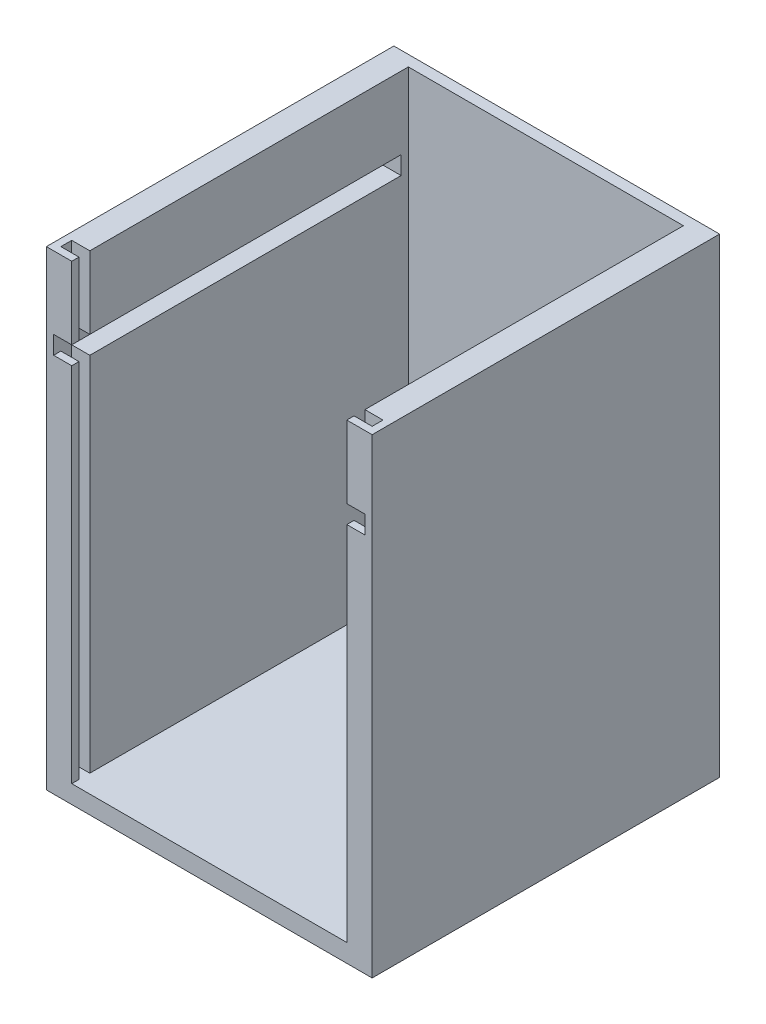
ISO-10303-21;
HEADER;
FILE_DESCRIPTION(('STEP AP214'),'2;1');
FILE_NAME('part.step','',(''),(''),'','','');
FILE_SCHEMA(('AUTOMOTIVE_DESIGN { 1 0 10303 214 1 1 1 1 }'));
ENDSEC;
DATA;
#1=APPLICATION_CONTEXT('core data for automotive mechanical design processes');
#2=APPLICATION_PROTOCOL_DEFINITION('international standard','automotive_design',2000,#1);
#3=PRODUCT_CONTEXT('',#1,'mechanical');
#4=PRODUCT('Part','Part','',(#3));
#5=PRODUCT_RELATED_PRODUCT_CATEGORY('part','',(#4));
#6=PRODUCT_DEFINITION_FORMATION('','',#4);
#7=PRODUCT_DEFINITION_CONTEXT('part definition',#1,'design');
#8=PRODUCT_DEFINITION('design','',#6,#7);
#9=PRODUCT_DEFINITION_SHAPE('','',#8);
#10=(LENGTH_UNIT() NAMED_UNIT(*) SI_UNIT(.MILLI.,.METRE.));
#11=(NAMED_UNIT(*) PLANE_ANGLE_UNIT() SI_UNIT($,.RADIAN.));
#12=(NAMED_UNIT(*) SI_UNIT($,.STERADIAN.) SOLID_ANGLE_UNIT());
#13=UNCERTAINTY_MEASURE_WITH_UNIT(LENGTH_MEASURE(1.E-05),#10,'distance_accuracy_value','');
#14=(GEOMETRIC_REPRESENTATION_CONTEXT(3) GLOBAL_UNCERTAINTY_ASSIGNED_CONTEXT((#13)) GLOBAL_UNIT_ASSIGNED_CONTEXT((#10,
#11,#12)) REPRESENTATION_CONTEXT('',''));
#15=CARTESIAN_POINT('',(0.,0.,0.));
#16=DIRECTION('',(0.,0.,1.));
#17=DIRECTION('',(1.,0.,0.));
#18=AXIS2_PLACEMENT_3D('',#15,#16,#17);
#19=CARTESIAN_POINT('',(86.,5.,3.));
#20=DIRECTION('',(1.,0.,0.));
#21=DIRECTION('',(0.,0.,-1.));
#22=AXIS2_PLACEMENT_3D('',#19,#20,#21);
#23=PLANE('',#22);
#24=DIRECTION('',(0.,1.,0.));
#25=VECTOR('',#24,1.);
#26=CARTESIAN_POINT('',(86.,0.,96.));
#27=LINE('',#26,#25);
#28=CARTESIAN_POINT('',(86.,-125.,96.));
#29=VERTEX_POINT('',#28);
#30=CARTESIAN_POINT('',(86.,-25.,96.));
#31=VERTEX_POINT('',#30);
#32=EDGE_CURVE('E291',#29,#31,#27,.T.);
#33=ORIENTED_EDGE('',*,*,#32,.T.);
#34=DIRECTION('',(0.,0.,-1.));
#35=VECTOR('',#34,1.);
#36=CARTESIAN_POINT('',(86.,-25.,3.));
#37=LINE('',#36,#35);
#38=CARTESIAN_POINT('',(86.,-25.,94.));
#39=VERTEX_POINT('',#38);
#40=EDGE_CURVE('E446',#31,#39,#37,.T.);
#41=ORIENTED_EDGE('',*,*,#40,.T.);
#42=DIRECTION('',(0.,-1.,0.));
#43=VECTOR('',#42,1.);
#44=CARTESIAN_POINT('',(86.,5.,94.));
#45=LINE('',#44,#43);
#46=CARTESIAN_POINT('',(86.,-125.,94.));
#47=VERTEX_POINT('',#46);
#48=EDGE_CURVE('E535',#39,#47,#45,.T.);
#49=ORIENTED_EDGE('',*,*,#48,.T.);
#50=DIRECTION('',(0.,0.,1.));
#51=VECTOR('',#50,1.);
#52=CARTESIAN_POINT('',(86.,-125.,3.));
#53=LINE('',#52,#51);
#54=EDGE_CURVE('E550',#47,#29,#53,.T.);
#55=ORIENTED_EDGE('',*,*,#54,.T.);
#56=EDGE_LOOP('',(#33,#41,#49,#55));
#57=FACE_BOUND('',#56,.T.);
#58=ADVANCED_FACE('F44',(#57),#23,.F.);
#59=CARTESIAN_POINT('',(10.,5.,3.));
#60=DIRECTION('',(-1.,0.,0.));
#61=DIRECTION('',(0.,0.,1.));
#62=AXIS2_PLACEMENT_3D('',#59,#60,#61);
#63=PLANE('',#62);
#64=DIRECTION('',(0.,1.,0.));
#65=VECTOR('',#64,1.);
#66=CARTESIAN_POINT('',(10.,5.,94.));
#67=LINE('',#66,#65);
#68=CARTESIAN_POINT('',(10.,-125.,94.));
#69=VERTEX_POINT('',#68);
#70=CARTESIAN_POINT('',(10.,-25.,94.));
#71=VERTEX_POINT('',#70);
#72=EDGE_CURVE('E531',#69,#71,#67,.T.);
#73=ORIENTED_EDGE('',*,*,#72,.T.);
#74=DIRECTION('',(0.,0.,1.));
#75=VECTOR('',#74,1.);
#76=CARTESIAN_POINT('',(10.,-25.,3.));
#77=LINE('',#76,#75);
#78=CARTESIAN_POINT('',(10.,-25.,96.));
#79=VERTEX_POINT('',#78);
#80=EDGE_CURVE('E469',#71,#79,#77,.T.);
#81=ORIENTED_EDGE('',*,*,#80,.T.);
#82=DIRECTION('',(0.,-1.,0.));
#83=VECTOR('',#82,1.);
#84=CARTESIAN_POINT('',(10.,0.,96.));
#85=LINE('',#84,#83);
#86=CARTESIAN_POINT('',(10.,-125.,96.));
#87=VERTEX_POINT('',#86);
#88=EDGE_CURVE('E290',#79,#87,#85,.T.);
#89=ORIENTED_EDGE('',*,*,#88,.T.);
#90=DIRECTION('',(0.,0.,-1.));
#91=VECTOR('',#90,1.);
#92=CARTESIAN_POINT('',(10.,-125.,3.));
#93=LINE('',#92,#91);
#94=EDGE_CURVE('E323',#87,#69,#93,.T.);
#95=ORIENTED_EDGE('',*,*,#94,.T.);
#96=EDGE_LOOP('',(#73,#81,#89,#95));
#97=FACE_BOUND('',#96,.T.);
#98=ADVANCED_FACE('F615',(#97),#63,.F.);
#99=CARTESIAN_POINT('',(0.,0.,94.));
#100=DIRECTION('',(0.,0.,1.));
#101=DIRECTION('',(1.,0.,0.));
#102=AXIS2_PLACEMENT_3D('',#99,#100,#101);
#103=PLANE('',#102);
#104=DIRECTION('',(0.,-1.,0.));
#105=VECTOR('',#104,1.);
#106=CARTESIAN_POINT('',(5.,0.,94.));
#107=LINE('',#106,#105);
#108=CARTESIAN_POINT('',(5.00000000000001,-25.,94.));
#109=VERTEX_POINT('',#108);
#110=CARTESIAN_POINT('',(5.00000000000002,-125.,94.));
#111=VERTEX_POINT('',#110);
#112=EDGE_CURVE('E477',#109,#111,#107,.T.);
#113=ORIENTED_EDGE('',*,*,#112,.F.);
#114=DIRECTION('',(1.,0.,0.));
#115=VECTOR('',#114,1.);
#116=CARTESIAN_POINT('',(0.,-25.,94.));
#117=LINE('',#116,#115);
#118=EDGE_CURVE('E465',#109,#71,#117,.T.);
#119=ORIENTED_EDGE('',*,*,#118,.T.);
#120=ORIENTED_EDGE('',*,*,#72,.F.);
#121=DIRECTION('',(1.,0.,0.));
#122=VECTOR('',#121,1.);
#123=CARTESIAN_POINT('',(5.00000000000002,-125.,94.));
#124=LINE('',#123,#122);
#125=EDGE_CURVE('E502',#111,#69,#124,.T.);
#126=ORIENTED_EDGE('',*,*,#125,.F.);
#127=EDGE_LOOP('',(#113,#119,#120,#126));
#128=FACE_BOUND('',#127,.T.);
#129=ADVANCED_FACE('F619',(#128),#103,.F.);
#130=CARTESIAN_POINT('',(0.,0.,91.));
#131=DIRECTION('',(0.,0.,1.));
#132=DIRECTION('',(1.,0.,0.));
#133=AXIS2_PLACEMENT_3D('',#130,#131,#132);
#134=PLANE('',#133);
#135=DIRECTION('',(1.,0.,0.));
#136=VECTOR('',#135,1.);
#137=CARTESIAN_POINT('',(0.,-25.,91.));
#138=LINE('',#137,#136);
#139=CARTESIAN_POINT('',(5.,-25.,91.));
#140=VERTEX_POINT('',#139);
#141=CARTESIAN_POINT('',(10.,-25.,91.));
#142=VERTEX_POINT('',#141);
#143=EDGE_CURVE('E458',#140,#142,#138,.T.);
#144=ORIENTED_EDGE('',*,*,#143,.F.);
#145=DIRECTION('',(0.,-1.,0.));
#146=VECTOR('',#145,1.);
#147=CARTESIAN_POINT('',(5.,0.,91.));
#148=LINE('',#147,#146);
#149=CARTESIAN_POINT('',(5.00000000000002,-125.,91.));
#150=VERTEX_POINT('',#149);
#151=EDGE_CURVE('E483',#140,#150,#148,.T.);
#152=ORIENTED_EDGE('',*,*,#151,.T.);
#153=DIRECTION('',(1.,0.,0.));
#154=VECTOR('',#153,1.);
#155=CARTESIAN_POINT('',(5.00000000000002,-125.,91.));
#156=LINE('',#155,#154);
#157=CARTESIAN_POINT('',(10.,-125.,91.));
#158=VERTEX_POINT('',#157);
#159=EDGE_CURVE('E484',#150,#158,#156,.T.);
#160=ORIENTED_EDGE('',*,*,#159,.T.);
#161=DIRECTION('',(0.,1.,0.));
#162=VECTOR('',#161,1.);
#163=CARTESIAN_POINT('',(10.,5.,91.));
#164=LINE('',#163,#162);
#165=EDGE_CURVE('E541',#158,#142,#164,.T.);
#166=ORIENTED_EDGE('',*,*,#165,.T.);
#167=EDGE_LOOP('',(#144,#152,#160,#166));
#168=FACE_BOUND('',#167,.T.);
#169=ADVANCED_FACE('F628',(#168),#134,.T.);
#170=DIRECTION('',(1.,0.,0.));
#171=VECTOR('',#170,1.);
#172=CARTESIAN_POINT('',(0.,-25.,91.));
#173=LINE('',#172,#171);
#174=CARTESIAN_POINT('',(86.,-25.,91.));
#175=VERTEX_POINT('',#174);
#176=CARTESIAN_POINT('',(91.,-25.,91.));
#177=VERTEX_POINT('',#176);
#178=EDGE_CURVE('E450',#175,#177,#173,.T.);
#179=ORIENTED_EDGE('',*,*,#178,.F.);
#180=DIRECTION('',(0.,-1.,0.));
#181=VECTOR('',#180,1.);
#182=CARTESIAN_POINT('',(86.,5.,91.));
#183=LINE('',#182,#181);
#184=CARTESIAN_POINT('',(86.,-125.,91.));
#185=VERTEX_POINT('',#184);
#186=EDGE_CURVE('E545',#175,#185,#183,.T.);
#187=ORIENTED_EDGE('',*,*,#186,.T.);
#188=CARTESIAN_POINT('',(91.,-125.,91.));
#189=VERTEX_POINT('',#188);
#190=EDGE_CURVE('E482',#185,#189,#156,.T.);
#191=ORIENTED_EDGE('',*,*,#190,.T.);
#192=DIRECTION('',(0.,1.,0.));
#193=VECTOR('',#192,1.);
#194=CARTESIAN_POINT('',(91.,0.,91.));
#195=LINE('',#194,#193);
#196=EDGE_CURVE('E488',#189,#177,#195,.T.);
#197=ORIENTED_EDGE('',*,*,#196,.T.);
#198=EDGE_LOOP('',(#179,#187,#191,#197));
#199=FACE_BOUND('',#198,.T.);
#200=ADVANCED_FACE('F743',(#199),#134,.T.);
#201=ORIENTED_EDGE('',*,*,#48,.F.);
#202=DIRECTION('',(1.,0.,0.));
#203=VECTOR('',#202,1.);
#204=CARTESIAN_POINT('',(0.,-25.,94.));
#205=LINE('',#204,#203);
#206=CARTESIAN_POINT('',(91.,-25.,94.));
#207=VERTEX_POINT('',#206);
#208=EDGE_CURVE('E442',#39,#207,#205,.T.);
#209=ORIENTED_EDGE('',*,*,#208,.T.);
#210=DIRECTION('',(0.,1.,0.));
#211=VECTOR('',#210,1.);
#212=CARTESIAN_POINT('',(91.,0.,94.));
#213=LINE('',#212,#211);
#214=CARTESIAN_POINT('',(91.,-125.,94.));
#215=VERTEX_POINT('',#214);
#216=EDGE_CURVE('E507',#215,#207,#213,.T.);
#217=ORIENTED_EDGE('',*,*,#216,.F.);
#218=EDGE_CURVE('E501',#47,#215,#124,.T.);
#219=ORIENTED_EDGE('',*,*,#218,.F.);
#220=EDGE_LOOP('',(#201,#209,#217,#219));
#221=FACE_BOUND('',#220,.T.);
#222=ADVANCED_FACE('F696',(#221),#103,.F.);
#223=CARTESIAN_POINT('',(0.,0.,96.));
#224=DIRECTION('',(0.,-1.,0.));
#225=DIRECTION('',(0.,0.,-1.));
#226=AXIS2_PLACEMENT_3D('',#223,#224,#225);
#227=PLANE('',#226);
#228=DIRECTION('',(-1.,0.,0.));
#229=VECTOR('',#228,1.);
#230=CARTESIAN_POINT('',(0.,0.,96.));
#231=LINE('',#230,#229);
#232=CARTESIAN_POINT('',(93.,0.,96.));
#233=VERTEX_POINT('',#232);
#234=CARTESIAN_POINT('',(86.,0.,96.));
#235=VERTEX_POINT('',#234);
#236=EDGE_CURVE('E265',#233,#235,#231,.T.);
#237=ORIENTED_EDGE('',*,*,#236,.F.);
#238=DIRECTION('',(0.,0.,1.));
#239=VECTOR('',#238,1.);
#240=CARTESIAN_POINT('',(93.,0.,0.));
#241=LINE('',#240,#239);
#242=CARTESIAN_POINT('',(93.,0.,0.));
#243=VERTEX_POINT('',#242);
#244=EDGE_CURVE('E255',#243,#233,#241,.T.);
#245=ORIENTED_EDGE('',*,*,#244,.F.);
#246=DIRECTION('',(-1.,0.,0.));
#247=VECTOR('',#246,1.);
#248=CARTESIAN_POINT('',(0.,0.,0.));
#249=LINE('',#248,#247);
#250=CARTESIAN_POINT('',(3.00000000000001,0.,0.));
#251=VERTEX_POINT('',#250);
#252=EDGE_CURVE('E68',#243,#251,#249,.T.);
#253=ORIENTED_EDGE('',*,*,#252,.T.);
#254=DIRECTION('',(0.,0.,-1.));
#255=VECTOR('',#254,1.);
#256=CARTESIAN_POINT('',(3.,0.,96.));
#257=LINE('',#256,#255);
#258=CARTESIAN_POINT('',(3.,0.,96.));
#259=VERTEX_POINT('',#258);
#260=EDGE_CURVE('E347',#259,#251,#257,.T.);
#261=ORIENTED_EDGE('',*,*,#260,.F.);
#262=CARTESIAN_POINT('',(10.,0.,96.));
#263=VERTEX_POINT('',#262);
#264=EDGE_CURVE('E279',#263,#259,#231,.T.);
#265=ORIENTED_EDGE('',*,*,#264,.F.);
#266=DIRECTION('',(0.,0.,-1.));
#267=VECTOR('',#266,1.);
#268=CARTESIAN_POINT('',(10.,0.,96.));
#269=LINE('',#268,#267);
#270=CARTESIAN_POINT('',(10.,0.,94.));
#271=VERTEX_POINT('',#270);
#272=EDGE_CURVE('E326',#263,#271,#269,.T.);
#273=ORIENTED_EDGE('',*,*,#272,.T.);
#274=DIRECTION('',(-1.,0.,0.));
#275=VECTOR('',#274,1.);
#276=CARTESIAN_POINT('',(5.,0.,94.));
#277=LINE('',#276,#275);
#278=CARTESIAN_POINT('',(5.,0.,94.));
#279=VERTEX_POINT('',#278);
#280=EDGE_CURVE('E511',#271,#279,#277,.T.);
#281=ORIENTED_EDGE('',*,*,#280,.T.);
#282=DIRECTION('',(0.,0.,1.));
#283=VECTOR('',#282,1.);
#284=CARTESIAN_POINT('',(5.,0.,91.));
#285=LINE('',#284,#283);
#286=CARTESIAN_POINT('',(5.,0.,91.));
#287=VERTEX_POINT('',#286);
#288=EDGE_CURVE('E516',#287,#279,#285,.T.);
#289=ORIENTED_EDGE('',*,*,#288,.F.);
#290=DIRECTION('',(-1.,0.,0.));
#291=VECTOR('',#290,1.);
#292=CARTESIAN_POINT('',(5.,0.,91.));
#293=LINE('',#292,#291);
#294=CARTESIAN_POINT('',(10.,0.,91.));
#295=VERTEX_POINT('',#294);
#296=EDGE_CURVE('E492',#295,#287,#293,.T.);
#297=ORIENTED_EDGE('',*,*,#296,.F.);
#298=CARTESIAN_POINT('',(10.,0.,3.));
#299=VERTEX_POINT('',#298);
#300=EDGE_CURVE('E301',#295,#299,#269,.T.);
#301=ORIENTED_EDGE('',*,*,#300,.T.);
#302=DIRECTION('',(1.,0.,0.));
#303=VECTOR('',#302,1.);
#304=CARTESIAN_POINT('',(0.,0.,3.));
#305=LINE('',#304,#303);
#306=CARTESIAN_POINT('',(86.,0.,3.));
#307=VERTEX_POINT('',#306);
#308=EDGE_CURVE('E53',#299,#307,#305,.T.);
#309=ORIENTED_EDGE('',*,*,#308,.T.);
#310=DIRECTION('',(0.,0.,1.));
#311=VECTOR('',#310,1.);
#312=CARTESIAN_POINT('',(86.,0.,96.));
#313=LINE('',#312,#311);
#314=CARTESIAN_POINT('',(86.,0.,91.));
#315=VERTEX_POINT('',#314);
#316=EDGE_CURVE('E281',#307,#315,#313,.T.);
#317=ORIENTED_EDGE('',*,*,#316,.T.);
#318=CARTESIAN_POINT('',(91.,0.,91.));
#319=VERTEX_POINT('',#318);
#320=EDGE_CURVE('E493',#319,#315,#293,.T.);
#321=ORIENTED_EDGE('',*,*,#320,.F.);
#322=DIRECTION('',(0.,0.,1.));
#323=VECTOR('',#322,1.);
#324=CARTESIAN_POINT('',(91.,0.,91.));
#325=LINE('',#324,#323);
#326=CARTESIAN_POINT('',(91.,0.,94.));
#327=VERTEX_POINT('',#326);
#328=EDGE_CURVE('E520',#319,#327,#325,.T.);
#329=ORIENTED_EDGE('',*,*,#328,.T.);
#330=CARTESIAN_POINT('',(86.,0.,94.));
#331=VERTEX_POINT('',#330);
#332=EDGE_CURVE('E512',#327,#331,#277,.T.);
#333=ORIENTED_EDGE('',*,*,#332,.T.);
#334=EDGE_CURVE('E330',#331,#235,#313,.T.);
#335=ORIENTED_EDGE('',*,*,#334,.T.);
#336=EDGE_LOOP('',(#237,#245,#253,#261,#265,#273,#281,#289,#297,#301,#309,#317,#321,#329,#333,#335));
#337=FACE_BOUND('',#336,.T.);
#338=ADVANCED_FACE('F263',(#337),#227,.F.);
#339=ORIENTED_EDGE('',*,*,#186,.F.);
#340=DIRECTION('',(0.,0.,-1.));
#341=VECTOR('',#340,1.);
#342=CARTESIAN_POINT('',(86.,-25.,3.));
#343=LINE('',#342,#341);
#344=CARTESIAN_POINT('',(86.,-25.,5.));
#345=VERTEX_POINT('',#344);
#346=EDGE_CURVE('E454',#175,#345,#343,.T.);
#347=ORIENTED_EDGE('',*,*,#346,.T.);
#348=DIRECTION('',(0.,1.,0.));
#349=VECTOR('',#348,1.);
#350=CARTESIAN_POINT('',(86.,5.,5.));
#351=LINE('',#350,#349);
#352=CARTESIAN_POINT('',(86.,-20.,5.));
#353=VERTEX_POINT('',#352);
#354=EDGE_CURVE('E473',#345,#353,#351,.T.);
#355=ORIENTED_EDGE('',*,*,#354,.T.);
#356=DIRECTION('',(0.,0.,1.));
#357=VECTOR('',#356,1.);
#358=CARTESIAN_POINT('',(86.,-20.,3.));
#359=LINE('',#358,#357);
#360=CARTESIAN_POINT('',(86.,-20.,91.));
#361=VERTEX_POINT('',#360);
#362=EDGE_CURVE('E422',#353,#361,#359,.T.);
#363=ORIENTED_EDGE('',*,*,#362,.T.);
#364=EDGE_CURVE('E546',#315,#361,#183,.T.);
#365=ORIENTED_EDGE('',*,*,#364,.F.);
#366=ORIENTED_EDGE('',*,*,#316,.F.);
#367=DIRECTION('',(0.,-1.,0.));
#368=VECTOR('',#367,1.);
#369=CARTESIAN_POINT('',(86.,5.,3.));
#370=LINE('',#369,#368);
#371=CARTESIAN_POINT('',(86.,-125.,3.));
#372=VERTEX_POINT('',#371);
#373=EDGE_CURVE('E310',#307,#372,#370,.T.);
#374=ORIENTED_EDGE('',*,*,#373,.T.);
#375=EDGE_CURVE('E551',#372,#185,#53,.T.);
#376=ORIENTED_EDGE('',*,*,#375,.T.);
#377=EDGE_LOOP('',(#339,#347,#355,#363,#365,#366,#374,#376));
#378=FACE_BOUND('',#377,.T.);
#379=ADVANCED_FACE('F651',(#378),#23,.F.);
#380=DIRECTION('',(0.,-1.,0.));
#381=VECTOR('',#380,1.);
#382=CARTESIAN_POINT('',(10.,5.,5.));
#383=LINE('',#382,#381);
#384=CARTESIAN_POINT('',(10.,-20.,5.));
#385=VERTEX_POINT('',#384);
#386=CARTESIAN_POINT('',(10.,-25.,5.));
#387=VERTEX_POINT('',#386);
#388=EDGE_CURVE('E11',#385,#387,#383,.T.);
#389=ORIENTED_EDGE('',*,*,#388,.T.);
#390=DIRECTION('',(0.,0.,1.));
#391=VECTOR('',#390,1.);
#392=CARTESIAN_POINT('',(10.,-25.,3.));
#393=LINE('',#392,#391);
#394=EDGE_CURVE('E461',#387,#142,#393,.T.);
#395=ORIENTED_EDGE('',*,*,#394,.T.);
#396=ORIENTED_EDGE('',*,*,#165,.F.);
#397=CARTESIAN_POINT('',(10.,-125.,3.));
#398=VERTEX_POINT('',#397);
#399=EDGE_CURVE('E316',#158,#398,#93,.T.);
#400=ORIENTED_EDGE('',*,*,#399,.T.);
#401=DIRECTION('',(0.,-1.,0.));
#402=VECTOR('',#401,1.);
#403=CARTESIAN_POINT('',(10.,5.,3.));
#404=LINE('',#403,#402);
#405=EDGE_CURVE('E308',#299,#398,#404,.T.);
#406=ORIENTED_EDGE('',*,*,#405,.F.);
#407=ORIENTED_EDGE('',*,*,#300,.F.);
#408=CARTESIAN_POINT('',(10.,-20.,91.));
#409=VERTEX_POINT('',#408);
#410=EDGE_CURVE('E540',#409,#295,#164,.T.);
#411=ORIENTED_EDGE('',*,*,#410,.F.);
#412=DIRECTION('',(0.,0.,-1.));
#413=VECTOR('',#412,1.);
#414=CARTESIAN_POINT('',(10.,-20.,3.));
#415=LINE('',#414,#413);
#416=EDGE_CURVE('E430',#409,#385,#415,.T.);
#417=ORIENTED_EDGE('',*,*,#416,.T.);
#418=EDGE_LOOP('',(#389,#395,#396,#400,#406,#407,#411,#417));
#419=FACE_BOUND('',#418,.T.);
#420=ADVANCED_FACE('F312',(#419),#63,.F.);
#421=CARTESIAN_POINT('',(0.,-130.,96.));
#422=DIRECTION('',(0.,1.,0.));
#423=DIRECTION('',(0.,0.,1.));
#424=AXIS2_PLACEMENT_3D('',#421,#422,#423);
#425=PLANE('',#424);
#426=DIRECTION('',(1.,0.,0.));
#427=VECTOR('',#426,1.);
#428=CARTESIAN_POINT('',(0.,-130.,0.));
#429=LINE('',#428,#427);
#430=CARTESIAN_POINT('',(3.00000000000002,-130.,0.));
#431=VERTEX_POINT('',#430);
#432=CARTESIAN_POINT('',(93.,-130.,0.));
#433=VERTEX_POINT('',#432);
#434=EDGE_CURVE('E274',#431,#433,#429,.T.);
#435=ORIENTED_EDGE('',*,*,#434,.T.);
#436=DIRECTION('',(0.,0.,-1.));
#437=VECTOR('',#436,1.);
#438=CARTESIAN_POINT('',(93.,-130.,0.));
#439=LINE('',#438,#437);
#440=CARTESIAN_POINT('',(93.,-130.,96.));
#441=VERTEX_POINT('',#440);
#442=EDGE_CURVE('E60',#441,#433,#439,.T.);
#443=ORIENTED_EDGE('',*,*,#442,.F.);
#444=DIRECTION('',(1.,0.,0.));
#445=VECTOR('',#444,1.);
#446=CARTESIAN_POINT('',(0.,-130.,96.));
#447=LINE('',#446,#445);
#448=CARTESIAN_POINT('',(3.00000000000002,-130.,96.));
#449=VERTEX_POINT('',#448);
#450=EDGE_CURVE('E273',#449,#441,#447,.T.);
#451=ORIENTED_EDGE('',*,*,#450,.F.);
#452=DIRECTION('',(0.,0.,1.));
#453=VECTOR('',#452,1.);
#454=CARTESIAN_POINT('',(3.00000000000002,-130.,96.));
#455=LINE('',#454,#453);
#456=EDGE_CURVE('E353',#431,#449,#455,.T.);
#457=ORIENTED_EDGE('',*,*,#456,.F.);
#458=EDGE_LOOP('',(#435,#443,#451,#457));
#459=FACE_BOUND('',#458,.T.);
#460=ADVANCED_FACE('F46',(#459),#425,.F.);
#461=CARTESIAN_POINT('',(0.,0.,96.));
#462=DIRECTION('',(0.,0.,1.));
#463=DIRECTION('',(1.,0.,0.));
#464=AXIS2_PLACEMENT_3D('',#461,#462,#463);
#465=PLANE('',#464);
#466=DIRECTION('',(0.,-1.,0.));
#467=VECTOR('',#466,1.);
#468=CARTESIAN_POINT('',(93.,0.,96.));
#469=LINE('',#468,#467);
#470=EDGE_CURVE('E267',#233,#441,#469,.T.);
#471=ORIENTED_EDGE('',*,*,#470,.F.);
#472=ORIENTED_EDGE('',*,*,#236,.T.);
#473=CARTESIAN_POINT('',(86.,-20.,96.));
#474=VERTEX_POINT('',#473);
#475=EDGE_CURVE('E289',#474,#235,#27,.T.);
#476=ORIENTED_EDGE('',*,*,#475,.F.);
#477=DIRECTION('',(-1.,0.,0.));
#478=VECTOR('',#477,1.);
#479=CARTESIAN_POINT('',(91.,-20.,96.));
#480=LINE('',#479,#478);
#481=CARTESIAN_POINT('',(91.,-20.,96.));
#482=VERTEX_POINT('',#481);
#483=EDGE_CURVE('E409',#482,#474,#480,.T.);
#484=ORIENTED_EDGE('',*,*,#483,.F.);
#485=DIRECTION('',(0.,1.,0.));
#486=VECTOR('',#485,1.);
#487=CARTESIAN_POINT('',(91.,-20.,96.));
#488=LINE('',#487,#486);
#489=CARTESIAN_POINT('',(91.,-25.,96.));
#490=VERTEX_POINT('',#489);
#491=EDGE_CURVE('E361',#490,#482,#488,.T.);
#492=ORIENTED_EDGE('',*,*,#491,.F.);
#493=DIRECTION('',(-1.,0.,0.));
#494=VECTOR('',#493,1.);
#495=CARTESIAN_POINT('',(91.,-25.,96.));
#496=LINE('',#495,#494);
#497=EDGE_CURVE('E393',#490,#31,#496,.T.);
#498=ORIENTED_EDGE('',*,*,#497,.T.);
#499=ORIENTED_EDGE('',*,*,#32,.F.);
#500=DIRECTION('',(-1.,0.,0.));
#501=VECTOR('',#500,1.);
#502=CARTESIAN_POINT('',(86.,-125.,96.));
#503=LINE('',#502,#501);
#504=EDGE_CURVE('E555',#29,#87,#503,.T.);
#505=ORIENTED_EDGE('',*,*,#504,.T.);
#506=ORIENTED_EDGE('',*,*,#88,.F.);
#507=CARTESIAN_POINT('',(5.,-25.,96.));
#508=VERTEX_POINT('',#507);
#509=EDGE_CURVE('E398',#79,#508,#496,.T.);
#510=ORIENTED_EDGE('',*,*,#509,.T.);
#511=DIRECTION('',(0.,1.,0.));
#512=VECTOR('',#511,1.);
#513=CARTESIAN_POINT('',(5.,-20.,96.));
#514=LINE('',#513,#512);
#515=CARTESIAN_POINT('',(5.,-20.,96.));
#516=VERTEX_POINT('',#515);
#517=EDGE_CURVE('E360',#508,#516,#514,.T.);
#518=ORIENTED_EDGE('',*,*,#517,.T.);
#519=CARTESIAN_POINT('',(10.,-20.,96.));
#520=VERTEX_POINT('',#519);
#521=EDGE_CURVE('E378',#520,#516,#480,.T.);
#522=ORIENTED_EDGE('',*,*,#521,.F.);
#523=EDGE_CURVE('E285',#263,#520,#85,.T.);
#524=ORIENTED_EDGE('',*,*,#523,.F.);
#525=ORIENTED_EDGE('',*,*,#264,.T.);
#526=DIRECTION('',(0.,1.,0.));
#527=VECTOR('',#526,1.);
#528=CARTESIAN_POINT('',(3.,0.,96.));
#529=LINE('',#528,#527);
#530=EDGE_CURVE('E343',#449,#259,#529,.T.);
#531=ORIENTED_EDGE('',*,*,#530,.F.);
#532=ORIENTED_EDGE('',*,*,#450,.T.);
#533=EDGE_LOOP('',(#471,#472,#476,#484,#492,#498,#499,#505,#506,#510,#518,#522,#524,#525,#531,#532));
#534=FACE_BOUND('',#533,.T.);
#535=ADVANCED_FACE('F342',(#534),#465,.T.);
#536=CARTESIAN_POINT('',(0.,0.,0.));
#537=DIRECTION('',(0.,0.,1.));
#538=DIRECTION('',(1.,0.,0.));
#539=AXIS2_PLACEMENT_3D('',#536,#537,#538);
#540=PLANE('',#539);
#541=ORIENTED_EDGE('',*,*,#252,.F.);
#542=DIRECTION('',(0.,1.,0.));
#543=VECTOR('',#542,1.);
#544=CARTESIAN_POINT('',(93.,0.,0.));
#545=LINE('',#544,#543);
#546=EDGE_CURVE('E253',#433,#243,#545,.T.);
#547=ORIENTED_EDGE('',*,*,#546,.F.);
#548=ORIENTED_EDGE('',*,*,#434,.F.);
#549=DIRECTION('',(0.,-1.,0.));
#550=VECTOR('',#549,1.);
#551=CARTESIAN_POINT('',(3.,0.,0.));
#552=LINE('',#551,#550);
#553=EDGE_CURVE('E271',#251,#431,#552,.T.);
#554=ORIENTED_EDGE('',*,*,#553,.F.);
#555=EDGE_LOOP('',(#541,#547,#548,#554));
#556=FACE_BOUND('',#555,.T.);
#557=ADVANCED_FACE('F270',(#556),#540,.F.);
#558=CARTESIAN_POINT('',(86.,5.,3.));
#559=DIRECTION('',(0.,0.,-1.));
#560=DIRECTION('',(-1.,0.,0.));
#561=AXIS2_PLACEMENT_3D('',#558,#559,#560);
#562=PLANE('',#561);
#563=ORIENTED_EDGE('',*,*,#405,.T.);
#564=DIRECTION('',(1.,0.,0.));
#565=VECTOR('',#564,1.);
#566=CARTESIAN_POINT('',(86.,-125.,3.));
#567=LINE('',#566,#565);
#568=EDGE_CURVE('E318',#398,#372,#567,.T.);
#569=ORIENTED_EDGE('',*,*,#568,.T.);
#570=ORIENTED_EDGE('',*,*,#373,.F.);
#571=ORIENTED_EDGE('',*,*,#308,.F.);
#572=EDGE_LOOP('',(#563,#569,#570,#571));
#573=FACE_BOUND('',#572,.T.);
#574=ADVANCED_FACE('F306',(#573),#562,.F.);
#575=CARTESIAN_POINT('',(86.,-20.,94.));
#576=VERTEX_POINT('',#575);
#577=EDGE_CURVE('E536',#331,#576,#45,.T.);
#578=ORIENTED_EDGE('',*,*,#577,.T.);
#579=DIRECTION('',(0.,0.,1.));
#580=VECTOR('',#579,1.);
#581=CARTESIAN_POINT('',(86.,-20.,3.));
#582=LINE('',#581,#580);
#583=EDGE_CURVE('E415',#576,#474,#582,.T.);
#584=ORIENTED_EDGE('',*,*,#583,.T.);
#585=ORIENTED_EDGE('',*,*,#475,.T.);
#586=ORIENTED_EDGE('',*,*,#334,.F.);
#587=EDGE_LOOP('',(#578,#584,#585,#586));
#588=FACE_BOUND('',#587,.T.);
#589=ADVANCED_FACE('F652',(#588),#23,.F.);
#590=ORIENTED_EDGE('',*,*,#523,.T.);
#591=DIRECTION('',(0.,0.,-1.));
#592=VECTOR('',#591,1.);
#593=CARTESIAN_POINT('',(10.,-20.,3.));
#594=LINE('',#593,#592);
#595=CARTESIAN_POINT('',(10.,-20.,94.));
#596=VERTEX_POINT('',#595);
#597=EDGE_CURVE('E438',#520,#596,#594,.T.);
#598=ORIENTED_EDGE('',*,*,#597,.T.);
#599=EDGE_CURVE('E519',#596,#271,#67,.T.);
#600=ORIENTED_EDGE('',*,*,#599,.T.);
#601=ORIENTED_EDGE('',*,*,#272,.F.);
#602=EDGE_LOOP('',(#590,#598,#600,#601));
#603=FACE_BOUND('',#602,.T.);
#604=ADVANCED_FACE('F658',(#603),#63,.F.);
#605=CARTESIAN_POINT('',(0.,-125.,0.));
#606=DIRECTION('',(0.,-1.,0.));
#607=DIRECTION('',(0.,0.,-1.));
#608=AXIS2_PLACEMENT_3D('',#605,#606,#607);
#609=PLANE('',#608);
#610=ORIENTED_EDGE('',*,*,#54,.F.);
#611=ORIENTED_EDGE('',*,*,#218,.T.);
#612=DIRECTION('',(0.,0.,1.));
#613=VECTOR('',#612,1.);
#614=CARTESIAN_POINT('',(91.,-125.,91.));
#615=LINE('',#614,#613);
#616=EDGE_CURVE('E524',#189,#215,#615,.T.);
#617=ORIENTED_EDGE('',*,*,#616,.F.);
#618=ORIENTED_EDGE('',*,*,#190,.F.);
#619=ORIENTED_EDGE('',*,*,#375,.F.);
#620=ORIENTED_EDGE('',*,*,#568,.F.);
#621=ORIENTED_EDGE('',*,*,#399,.F.);
#622=ORIENTED_EDGE('',*,*,#159,.F.);
#623=DIRECTION('',(0.,0.,1.));
#624=VECTOR('',#623,1.);
#625=CARTESIAN_POINT('',(5.00000000000002,-125.,91.));
#626=LINE('',#625,#624);
#627=EDGE_CURVE('E496',#150,#111,#626,.T.);
#628=ORIENTED_EDGE('',*,*,#627,.T.);
#629=ORIENTED_EDGE('',*,*,#125,.T.);
#630=ORIENTED_EDGE('',*,*,#94,.F.);
#631=ORIENTED_EDGE('',*,*,#504,.F.);
#632=EDGE_LOOP('',(#610,#611,#617,#618,#619,#620,#621,#622,#628,#629,#630,#631));
#633=FACE_BOUND('',#632,.T.);
#634=ADVANCED_FACE('F622',(#633),#609,.F.);
#635=ORIENTED_EDGE('',*,*,#599,.F.);
#636=DIRECTION('',(-1.,0.,0.));
#637=VECTOR('',#636,1.);
#638=CARTESIAN_POINT('',(0.,-20.,94.));
#639=LINE('',#638,#637);
#640=CARTESIAN_POINT('',(5.,-20.,94.));
#641=VERTEX_POINT('',#640);
#642=EDGE_CURVE('E434',#596,#641,#639,.T.);
#643=ORIENTED_EDGE('',*,*,#642,.T.);
#644=EDGE_CURVE('E497',#279,#641,#107,.T.);
#645=ORIENTED_EDGE('',*,*,#644,.F.);
#646=ORIENTED_EDGE('',*,*,#280,.F.);
#647=EDGE_LOOP('',(#635,#643,#645,#646));
#648=FACE_BOUND('',#647,.T.);
#649=ADVANCED_FACE('F607',(#648),#103,.F.);
#650=DIRECTION('',(-1.,0.,0.));
#651=VECTOR('',#650,1.);
#652=CARTESIAN_POINT('',(0.,-20.,91.));
#653=LINE('',#652,#651);
#654=CARTESIAN_POINT('',(5.00000000000001,-20.,91.));
#655=VERTEX_POINT('',#654);
#656=EDGE_CURVE('E426',#409,#655,#653,.T.);
#657=ORIENTED_EDGE('',*,*,#656,.F.);
#658=ORIENTED_EDGE('',*,*,#410,.T.);
#659=ORIENTED_EDGE('',*,*,#296,.T.);
#660=EDGE_CURVE('E478',#287,#655,#148,.T.);
#661=ORIENTED_EDGE('',*,*,#660,.T.);
#662=EDGE_LOOP('',(#657,#658,#659,#661));
#663=FACE_BOUND('',#662,.T.);
#664=ADVANCED_FACE('F601',(#663),#134,.T.);
#665=CARTESIAN_POINT('',(5.,0.,91.));
#666=DIRECTION('',(-1.,0.,0.));
#667=DIRECTION('',(0.,-1.,0.));
#668=AXIS2_PLACEMENT_3D('',#665,#666,#667);
#669=PLANE('',#668);
#670=ORIENTED_EDGE('',*,*,#644,.T.);
#671=DIRECTION('',(0.,0.,-1.));
#672=VECTOR('',#671,1.);
#673=CARTESIAN_POINT('',(5.,-20.,96.));
#674=LINE('',#673,#672);
#675=EDGE_CURVE('E383',#516,#641,#674,.T.);
#676=ORIENTED_EDGE('',*,*,#675,.F.);
#677=ORIENTED_EDGE('',*,*,#517,.F.);
#678=DIRECTION('',(0.,0.,1.));
#679=VECTOR('',#678,1.);
#680=CARTESIAN_POINT('',(5.,-25.,96.));
#681=LINE('',#680,#679);
#682=EDGE_CURVE('E390',#109,#508,#681,.T.);
#683=ORIENTED_EDGE('',*,*,#682,.F.);
#684=ORIENTED_EDGE('',*,*,#112,.T.);
#685=ORIENTED_EDGE('',*,*,#627,.F.);
#686=ORIENTED_EDGE('',*,*,#151,.F.);
#687=CARTESIAN_POINT('',(5.,-25.,5.));
#688=VERTEX_POINT('',#687);
#689=EDGE_CURVE('E366',#688,#140,#681,.T.);
#690=ORIENTED_EDGE('',*,*,#689,.F.);
#691=DIRECTION('',(0.,-1.,0.));
#692=VECTOR('',#691,1.);
#693=CARTESIAN_POINT('',(5.,-20.,5.));
#694=LINE('',#693,#692);
#695=CARTESIAN_POINT('',(5.,-20.,5.));
#696=VERTEX_POINT('',#695);
#697=EDGE_CURVE('E386',#696,#688,#694,.T.);
#698=ORIENTED_EDGE('',*,*,#697,.F.);
#699=EDGE_CURVE('E382',#655,#696,#674,.T.);
#700=ORIENTED_EDGE('',*,*,#699,.F.);
#701=ORIENTED_EDGE('',*,*,#660,.F.);
#702=ORIENTED_EDGE('',*,*,#288,.T.);
#703=EDGE_LOOP('',(#670,#676,#677,#683,#684,#685,#686,#690,#698,#700,#701,#702));
#704=FACE_BOUND('',#703,.T.);
#705=ADVANCED_FACE('F595',(#704),#669,.F.);
#706=DIRECTION('',(-1.,0.,0.));
#707=VECTOR('',#706,1.);
#708=CARTESIAN_POINT('',(0.,-20.,91.));
#709=LINE('',#708,#707);
#710=CARTESIAN_POINT('',(91.,-20.,91.));
#711=VERTEX_POINT('',#710);
#712=EDGE_CURVE('E419',#711,#361,#709,.T.);
#713=ORIENTED_EDGE('',*,*,#712,.F.);
#714=EDGE_CURVE('E487',#711,#319,#195,.T.);
#715=ORIENTED_EDGE('',*,*,#714,.T.);
#716=ORIENTED_EDGE('',*,*,#320,.T.);
#717=ORIENTED_EDGE('',*,*,#364,.T.);
#718=EDGE_LOOP('',(#713,#715,#716,#717));
#719=FACE_BOUND('',#718,.T.);
#720=ADVANCED_FACE('F734',(#719),#134,.T.);
#721=CARTESIAN_POINT('',(91.,-20.,94.));
#722=VERTEX_POINT('',#721);
#723=EDGE_CURVE('E506',#722,#327,#213,.T.);
#724=ORIENTED_EDGE('',*,*,#723,.F.);
#725=DIRECTION('',(-1.,0.,0.));
#726=VECTOR('',#725,1.);
#727=CARTESIAN_POINT('',(0.,-20.,94.));
#728=LINE('',#727,#726);
#729=EDGE_CURVE('E397',#722,#576,#728,.T.);
#730=ORIENTED_EDGE('',*,*,#729,.T.);
#731=ORIENTED_EDGE('',*,*,#577,.F.);
#732=ORIENTED_EDGE('',*,*,#332,.F.);
#733=EDGE_LOOP('',(#724,#730,#731,#732));
#734=FACE_BOUND('',#733,.T.);
#735=ADVANCED_FACE('F675',(#734),#103,.F.);
#736=CARTESIAN_POINT('',(91.,0.,91.));
#737=DIRECTION('',(1.,0.,0.));
#738=DIRECTION('',(0.,1.,0.));
#739=AXIS2_PLACEMENT_3D('',#736,#737,#738);
#740=PLANE('',#739);
#741=ORIENTED_EDGE('',*,*,#714,.F.);
#742=DIRECTION('',(0.,0.,-1.));
#743=VECTOR('',#742,1.);
#744=CARTESIAN_POINT('',(91.,-20.,96.));
#745=LINE('',#744,#743);
#746=CARTESIAN_POINT('',(91.,-20.,5.));
#747=VERTEX_POINT('',#746);
#748=EDGE_CURVE('E365',#711,#747,#745,.T.);
#749=ORIENTED_EDGE('',*,*,#748,.T.);
#750=DIRECTION('',(0.,-1.,0.));
#751=VECTOR('',#750,1.);
#752=CARTESIAN_POINT('',(91.,-20.,5.));
#753=LINE('',#752,#751);
#754=CARTESIAN_POINT('',(91.,-25.,5.));
#755=VERTEX_POINT('',#754);
#756=EDGE_CURVE('E370',#747,#755,#753,.T.);
#757=ORIENTED_EDGE('',*,*,#756,.T.);
#758=DIRECTION('',(0.,0.,1.));
#759=VECTOR('',#758,1.);
#760=CARTESIAN_POINT('',(91.,-25.,96.));
#761=LINE('',#760,#759);
#762=EDGE_CURVE('E375',#755,#177,#761,.T.);
#763=ORIENTED_EDGE('',*,*,#762,.T.);
#764=ORIENTED_EDGE('',*,*,#196,.F.);
#765=ORIENTED_EDGE('',*,*,#616,.T.);
#766=ORIENTED_EDGE('',*,*,#216,.T.);
#767=EDGE_CURVE('E374',#207,#490,#761,.T.);
#768=ORIENTED_EDGE('',*,*,#767,.T.);
#769=ORIENTED_EDGE('',*,*,#491,.T.);
#770=EDGE_CURVE('E367',#482,#722,#745,.T.);
#771=ORIENTED_EDGE('',*,*,#770,.T.);
#772=ORIENTED_EDGE('',*,*,#723,.T.);
#773=ORIENTED_EDGE('',*,*,#328,.F.);
#774=EDGE_LOOP('',(#741,#749,#757,#763,#764,#765,#766,#768,#769,#771,#772,#773));
#775=FACE_BOUND('',#774,.T.);
#776=ADVANCED_FACE('F680',(#775),#740,.F.);
#777=CARTESIAN_POINT('',(91.,-20.,96.));
#778=DIRECTION('',(0.,1.,0.));
#779=DIRECTION('',(-1.,0.,0.));
#780=AXIS2_PLACEMENT_3D('',#777,#778,#779);
#781=PLANE('',#780);
#782=ORIENTED_EDGE('',*,*,#729,.F.);
#783=ORIENTED_EDGE('',*,*,#770,.F.);
#784=ORIENTED_EDGE('',*,*,#483,.T.);
#785=ORIENTED_EDGE('',*,*,#583,.F.);
#786=EDGE_LOOP('',(#782,#783,#784,#785));
#787=FACE_BOUND('',#786,.T.);
#788=ADVANCED_FACE('F684',(#787),#781,.F.);
#789=CARTESIAN_POINT('',(91.,-25.,96.));
#790=DIRECTION('',(0.,-1.,0.));
#791=DIRECTION('',(1.,0.,0.));
#792=AXIS2_PLACEMENT_3D('',#789,#790,#791);
#793=PLANE('',#792);
#794=ORIENTED_EDGE('',*,*,#497,.F.);
#795=ORIENTED_EDGE('',*,*,#767,.F.);
#796=ORIENTED_EDGE('',*,*,#208,.F.);
#797=ORIENTED_EDGE('',*,*,#40,.F.);
#798=EDGE_LOOP('',(#794,#795,#796,#797));
#799=FACE_BOUND('',#798,.T.);
#800=ADVANCED_FACE('F646',(#799),#793,.F.);
#801=DIRECTION('',(-1.,0.,0.));
#802=VECTOR('',#801,1.);
#803=CARTESIAN_POINT('',(91.,-20.,5.));
#804=LINE('',#803,#802);
#805=EDGE_CURVE('E404',#747,#353,#804,.T.);
#806=ORIENTED_EDGE('',*,*,#805,.F.);
#807=ORIENTED_EDGE('',*,*,#748,.F.);
#808=ORIENTED_EDGE('',*,*,#712,.T.);
#809=ORIENTED_EDGE('',*,*,#362,.F.);
#810=EDGE_LOOP('',(#806,#807,#808,#809));
#811=FACE_BOUND('',#810,.T.);
#812=ADVANCED_FACE('F641',(#811),#781,.F.);
#813=ORIENTED_EDGE('',*,*,#178,.T.);
#814=ORIENTED_EDGE('',*,*,#762,.F.);
#815=DIRECTION('',(-1.,0.,0.));
#816=VECTOR('',#815,1.);
#817=CARTESIAN_POINT('',(91.,-25.,5.));
#818=LINE('',#817,#816);
#819=EDGE_CURVE('E399',#755,#345,#818,.T.);
#820=ORIENTED_EDGE('',*,*,#819,.T.);
#821=ORIENTED_EDGE('',*,*,#346,.F.);
#822=EDGE_LOOP('',(#813,#814,#820,#821));
#823=FACE_BOUND('',#822,.T.);
#824=ADVANCED_FACE('F633',(#823),#793,.F.);
#825=CARTESIAN_POINT('',(91.,-20.,5.));
#826=DIRECTION('',(0.,0.,-1.));
#827=DIRECTION('',(-1.,0.,0.));
#828=AXIS2_PLACEMENT_3D('',#825,#826,#827);
#829=PLANE('',#828);
#830=ORIENTED_EDGE('',*,*,#819,.F.);
#831=ORIENTED_EDGE('',*,*,#756,.F.);
#832=ORIENTED_EDGE('',*,*,#805,.T.);
#833=ORIENTED_EDGE('',*,*,#354,.F.);
#834=EDGE_LOOP('',(#830,#831,#832,#833));
#835=FACE_BOUND('',#834,.T.);
#836=ADVANCED_FACE('F639',(#835),#829,.F.);
#837=ORIENTED_EDGE('',*,*,#656,.T.);
#838=ORIENTED_EDGE('',*,*,#699,.T.);
#839=EDGE_CURVE('E408',#385,#696,#804,.T.);
#840=ORIENTED_EDGE('',*,*,#839,.F.);
#841=ORIENTED_EDGE('',*,*,#416,.F.);
#842=EDGE_LOOP('',(#837,#838,#840,#841));
#843=FACE_BOUND('',#842,.T.);
#844=ADVANCED_FACE('F590',(#843),#781,.F.);
#845=EDGE_CURVE('E403',#387,#688,#818,.T.);
#846=ORIENTED_EDGE('',*,*,#845,.T.);
#847=ORIENTED_EDGE('',*,*,#689,.T.);
#848=ORIENTED_EDGE('',*,*,#143,.T.);
#849=ORIENTED_EDGE('',*,*,#394,.F.);
#850=EDGE_LOOP('',(#846,#847,#848,#849));
#851=FACE_BOUND('',#850,.T.);
#852=ADVANCED_FACE('F630',(#851),#793,.F.);
#853=ORIENTED_EDGE('',*,*,#839,.T.);
#854=ORIENTED_EDGE('',*,*,#697,.T.);
#855=ORIENTED_EDGE('',*,*,#845,.F.);
#856=ORIENTED_EDGE('',*,*,#388,.F.);
#857=EDGE_LOOP('',(#853,#854,#855,#856));
#858=FACE_BOUND('',#857,.T.);
#859=ADVANCED_FACE('F599',(#858),#829,.F.);
#860=ORIENTED_EDGE('',*,*,#118,.F.);
#861=ORIENTED_EDGE('',*,*,#682,.T.);
#862=ORIENTED_EDGE('',*,*,#509,.F.);
#863=ORIENTED_EDGE('',*,*,#80,.F.);
#864=EDGE_LOOP('',(#860,#861,#862,#863));
#865=FACE_BOUND('',#864,.T.);
#866=ADVANCED_FACE('F614',(#865),#793,.F.);
#867=ORIENTED_EDGE('',*,*,#521,.T.);
#868=ORIENTED_EDGE('',*,*,#675,.T.);
#869=ORIENTED_EDGE('',*,*,#642,.F.);
#870=ORIENTED_EDGE('',*,*,#597,.F.);
#871=EDGE_LOOP('',(#867,#868,#869,#870));
#872=FACE_BOUND('',#871,.T.);
#873=ADVANCED_FACE('F642',(#872),#781,.F.);
#874=CARTESIAN_POINT('',(3.,0.,0.));
#875=DIRECTION('',(1.,0.,0.));
#876=DIRECTION('',(0.,1.,0.));
#877=AXIS2_PLACEMENT_3D('',#874,#875,#876);
#878=PLANE('',#877);
#879=ORIENTED_EDGE('',*,*,#530,.T.);
#880=ORIENTED_EDGE('',*,*,#260,.T.);
#881=ORIENTED_EDGE('',*,*,#553,.T.);
#882=ORIENTED_EDGE('',*,*,#456,.T.);
#883=EDGE_LOOP('',(#879,#880,#881,#882));
#884=FACE_BOUND('',#883,.T.);
#885=ADVANCED_FACE('F708',(#884),#878,.F.);
#886=CARTESIAN_POINT('',(93.,0.,0.));
#887=DIRECTION('',(-1.,0.,0.));
#888=DIRECTION('',(0.,-1.,0.));
#889=AXIS2_PLACEMENT_3D('',#886,#887,#888);
#890=PLANE('',#889);
#891=ORIENTED_EDGE('',*,*,#546,.T.);
#892=ORIENTED_EDGE('',*,*,#244,.T.);
#893=ORIENTED_EDGE('',*,*,#470,.T.);
#894=ORIENTED_EDGE('',*,*,#442,.T.);
#895=EDGE_LOOP('',(#891,#892,#893,#894));
#896=FACE_BOUND('',#895,.T.);
#897=ADVANCED_FACE('F254',(#896),#890,.F.);
#898=CLOSED_SHELL('',(#58,#98,#129,#169,#200,#222,#338,#379,#420,#460,#535,#557,#574,#589,#604,
#634,#649,#664,#705,#720,#735,#776,#788,#800,#812,#824,#836,#844,#852,#859,#866,#873,#885,#897));
#899=MANIFOLD_SOLID_BREP('B2',#898);
#900=ADVANCED_BREP_SHAPE_REPRESENTATION('',(#18,#899),#14);
#901=SHAPE_DEFINITION_REPRESENTATION(#9,#900);
ENDSEC;
END-ISO-10303-21;
